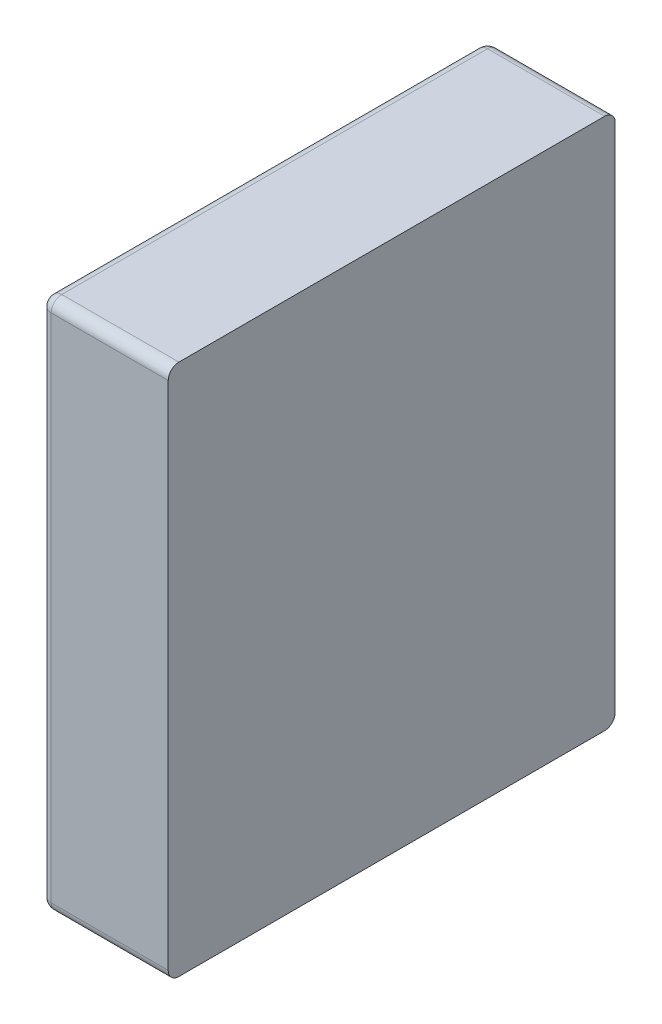
ISO-10303-21;
HEADER;
FILE_DESCRIPTION(('STEP AP214'),'2;1');
FILE_NAME('part.step','',(''),(''),'','','');
FILE_SCHEMA(('AUTOMOTIVE_DESIGN { 1 0 10303 214 1 1 1 1 }'));
ENDSEC;
DATA;
#1=APPLICATION_CONTEXT('core data for automotive mechanical design processes');
#2=APPLICATION_PROTOCOL_DEFINITION('international standard','automotive_design',2000,#1);
#3=PRODUCT_CONTEXT('',#1,'mechanical');
#4=PRODUCT('Part','Part','',(#3));
#5=PRODUCT_RELATED_PRODUCT_CATEGORY('part','',(#4));
#6=PRODUCT_DEFINITION_FORMATION('','',#4);
#7=PRODUCT_DEFINITION_CONTEXT('part definition',#1,'design');
#8=PRODUCT_DEFINITION('design','',#6,#7);
#9=PRODUCT_DEFINITION_SHAPE('','',#8);
#10=(LENGTH_UNIT() NAMED_UNIT(*) SI_UNIT(.MILLI.,.METRE.));
#11=(NAMED_UNIT(*) PLANE_ANGLE_UNIT() SI_UNIT($,.RADIAN.));
#12=(NAMED_UNIT(*) SI_UNIT($,.STERADIAN.) SOLID_ANGLE_UNIT());
#13=UNCERTAINTY_MEASURE_WITH_UNIT(LENGTH_MEASURE(1.E-05),#10,'distance_accuracy_value','');
#14=(GEOMETRIC_REPRESENTATION_CONTEXT(3) GLOBAL_UNCERTAINTY_ASSIGNED_CONTEXT((#13)) GLOBAL_UNIT_ASSIGNED_CONTEXT((#10,
#11,#12)) REPRESENTATION_CONTEXT('',''));
#15=CARTESIAN_POINT('',(0.,0.,0.));
#16=DIRECTION('',(0.,0.,1.));
#17=DIRECTION('',(1.,0.,0.));
#18=AXIS2_PLACEMENT_3D('',#15,#16,#17);
#19=CARTESIAN_POINT('',(-1.15,1.2,0.0499999999999999));
#20=DIRECTION('',(-1.,0.,0.));
#21=DIRECTION('',(0.,0.707106781186548,-0.707106781186547));
#22=AXIS2_PLACEMENT_3D('',#19,#20,#21);
#23=CYLINDRICAL_SURFACE('',#22,0.0499999999999999);
#24=CARTESIAN_POINT('',(-1.,1.2,0.0499999999999999));
#25=DIRECTION('',(-1.,0.,0.));
#26=DIRECTION('',(0.,0.707106781186548,-0.707106781186547));
#27=AXIS2_PLACEMENT_3D('',#24,#25,#26);
#28=CIRCLE('',#27,0.0499999999999999);
#29=CARTESIAN_POINT('',(-1.,1.25,0.0499999999999999));
#30=VERTEX_POINT('',#29);
#31=CARTESIAN_POINT('',(-1.,1.2,0.));
#32=VERTEX_POINT('',#31);
#33=EDGE_CURVE('E11',#30,#32,#28,.T.);
#34=ORIENTED_EDGE('',*,*,#33,.T.);
#35=DIRECTION('',(-1.,0.,0.));
#36=VECTOR('',#35,1.);
#37=CARTESIAN_POINT('',(-1.15,1.2,0.));
#38=LINE('',#37,#36);
#39=CARTESIAN_POINT('',(-1.55,1.2,0.));
#40=VERTEX_POINT('',#39);
#41=EDGE_CURVE('E24',#32,#40,#38,.T.);
#42=ORIENTED_EDGE('',*,*,#41,.T.);
#43=CARTESIAN_POINT('',(-1.55,1.2,0.0499999999999999));
#44=DIRECTION('',(1.,0.,0.));
#45=DIRECTION('',(0.,0.,-1.));
#46=AXIS2_PLACEMENT_3D('',#43,#44,#45);
#47=CIRCLE('',#46,0.0499999999999999);
#48=CARTESIAN_POINT('',(-1.55,1.25,0.0499999999999999));
#49=VERTEX_POINT('',#48);
#50=EDGE_CURVE('E249',#40,#49,#47,.T.);
#51=ORIENTED_EDGE('',*,*,#50,.T.);
#52=DIRECTION('',(1.,0.,0.));
#53=VECTOR('',#52,1.);
#54=CARTESIAN_POINT('',(-1.15,1.25,0.0499999999999999));
#55=LINE('',#54,#53);
#56=EDGE_CURVE('E247',#49,#30,#55,.T.);
#57=ORIENTED_EDGE('',*,*,#56,.T.);
#58=EDGE_LOOP('',(#34,#42,#51,#57));
#59=FACE_BOUND('',#58,.T.);
#60=ADVANCED_FACE('F17',(#59),#23,.T.);
#61=CARTESIAN_POINT('',(-1.55,0.6,0.0499999999999999));
#62=DIRECTION('',(0.,-1.,0.));
#63=DIRECTION('',(-0.707106781186548,0.,-0.707106781186547));
#64=AXIS2_PLACEMENT_3D('',#61,#62,#63);
#65=CYLINDRICAL_SURFACE('',#64,0.0499999999999999);
#66=CARTESIAN_POINT('',(-1.55,1.2,0.0499999999999999));
#67=DIRECTION('',(0.,-1.,0.));
#68=DIRECTION('',(-1.,0.,0.));
#69=AXIS2_PLACEMENT_3D('',#66,#67,#68);
#70=CIRCLE('',#69,0.0499999999999999);
#71=CARTESIAN_POINT('',(-1.6,1.2,0.0499999999999999));
#72=VERTEX_POINT('',#71);
#73=EDGE_CURVE('E235',#72,#40,#70,.T.);
#74=ORIENTED_EDGE('',*,*,#73,.T.);
#75=DIRECTION('',(0.,-1.,0.));
#76=VECTOR('',#75,1.);
#77=CARTESIAN_POINT('',(-1.55,0.6,0.));
#78=LINE('',#77,#76);
#79=CARTESIAN_POINT('',(-1.55,-1.2,0.));
#80=VERTEX_POINT('',#79);
#81=EDGE_CURVE('E225',#40,#80,#78,.T.);
#82=ORIENTED_EDGE('',*,*,#81,.T.);
#83=CARTESIAN_POINT('',(-1.55,-1.2,0.0499999999999999));
#84=DIRECTION('',(0.,1.,0.));
#85=DIRECTION('',(0.,0.,-1.));
#86=AXIS2_PLACEMENT_3D('',#83,#84,#85);
#87=CIRCLE('',#86,0.0499999999999999);
#88=CARTESIAN_POINT('',(-1.6,-1.2,0.0499999999999999));
#89=VERTEX_POINT('',#88);
#90=EDGE_CURVE('E190',#80,#89,#87,.T.);
#91=ORIENTED_EDGE('',*,*,#90,.T.);
#92=DIRECTION('',(0.,1.,0.));
#93=VECTOR('',#92,1.);
#94=CARTESIAN_POINT('',(-1.6,0.6,0.0499999999999999));
#95=LINE('',#94,#93);
#96=EDGE_CURVE('E185',#89,#72,#95,.T.);
#97=ORIENTED_EDGE('',*,*,#96,.T.);
#98=EDGE_LOOP('',(#74,#82,#91,#97));
#99=FACE_BOUND('',#98,.T.);
#100=ADVANCED_FACE('F217',(#99),#65,.T.);
#101=CARTESIAN_POINT('',(-1.55,1.2,0.0499999999999999));
#102=DIRECTION('',(0.408248290463866,-0.408248290463862,-0.816496580927725));
#103=DIRECTION('',(-0.577350269189627,0.577350269189623,-0.577350269189627));
#104=AXIS2_PLACEMENT_3D('',#101,#102,#103);
#105=SPHERICAL_SURFACE('',#104,0.0499999999999999);
#106=ORIENTED_EDGE('',*,*,#73,.F.);
#107=CARTESIAN_POINT('',(-1.55,1.2,0.0499999999999999));
#108=DIRECTION('',(0.,0.,-1.));
#109=DIRECTION('',(0.,1.,0.));
#110=AXIS2_PLACEMENT_3D('',#107,#108,#109);
#111=CIRCLE('',#110,0.0500000000000004);
#112=EDGE_CURVE('E180',#72,#49,#111,.T.);
#113=ORIENTED_EDGE('',*,*,#112,.T.);
#114=ORIENTED_EDGE('',*,*,#50,.F.);
#115=EDGE_LOOP('',(#106,#113,#114));
#116=FACE_BOUND('',#115,.T.);
#117=ADVANCED_FACE('F213',(#116),#105,.T.);
#118=CARTESIAN_POINT('',(-1.425,-1.2,0.0499999999999999));
#119=DIRECTION('',(1.,0.,0.));
#120=DIRECTION('',(0.,-0.707106781186548,-0.707106781186547));
#121=AXIS2_PLACEMENT_3D('',#118,#119,#120);
#122=CYLINDRICAL_SURFACE('',#121,0.0499999999999999);
#123=CARTESIAN_POINT('',(-1.,-1.2,0.0499999999999999));
#124=DIRECTION('',(-1.,0.,0.));
#125=DIRECTION('',(0.,-0.707106781186548,-0.707106781186547));
#126=AXIS2_PLACEMENT_3D('',#123,#124,#125);
#127=CIRCLE('',#126,0.0499999999999999);
#128=CARTESIAN_POINT('',(-1.,-1.2,0.));
#129=VERTEX_POINT('',#128);
#130=CARTESIAN_POINT('',(-1.,-1.25,0.0499999999999999));
#131=VERTEX_POINT('',#130);
#132=EDGE_CURVE('E178',#129,#131,#127,.T.);
#133=ORIENTED_EDGE('',*,*,#132,.T.);
#134=DIRECTION('',(-1.,0.,0.));
#135=VECTOR('',#134,1.);
#136=CARTESIAN_POINT('',(-1.425,-1.25,0.0499999999999999));
#137=LINE('',#136,#135);
#138=CARTESIAN_POINT('',(-1.55,-1.25,0.0499999999999999));
#139=VERTEX_POINT('',#138);
#140=EDGE_CURVE('E176',#131,#139,#137,.T.);
#141=ORIENTED_EDGE('',*,*,#140,.T.);
#142=CARTESIAN_POINT('',(-1.55,-1.2,0.0499999999999999));
#143=DIRECTION('',(1.,0.,0.));
#144=DIRECTION('',(0.,-1.,0.));
#145=AXIS2_PLACEMENT_3D('',#142,#143,#144);
#146=CIRCLE('',#145,0.0500000000000001);
#147=EDGE_CURVE('E171',#139,#80,#146,.T.);
#148=ORIENTED_EDGE('',*,*,#147,.T.);
#149=DIRECTION('',(1.,0.,0.));
#150=VECTOR('',#149,1.);
#151=CARTESIAN_POINT('',(-1.425,-1.2,0.));
#152=LINE('',#151,#150);
#153=EDGE_CURVE('E166',#80,#129,#152,.T.);
#154=ORIENTED_EDGE('',*,*,#153,.T.);
#155=EDGE_LOOP('',(#133,#141,#148,#154));
#156=FACE_BOUND('',#155,.T.);
#157=ADVANCED_FACE('F208',(#156),#122,.T.);
#158=CARTESIAN_POINT('',(-1.55,-1.2,0.0499999999999999));
#159=DIRECTION('',(-0.816496580927728,0.408248290463862,0.408248290463861));
#160=DIRECTION('',(-0.577350269189624,-0.577350269189629,-0.577350269189625));
#161=AXIS2_PLACEMENT_3D('',#158,#159,#160);
#162=SPHERICAL_SURFACE('',#161,0.0499999999999999);
#163=ORIENTED_EDGE('',*,*,#147,.F.);
#164=CARTESIAN_POINT('',(-1.55,-1.2,0.0499999999999999));
#165=DIRECTION('',(0.,0.,-1.));
#166=DIRECTION('',(-1.,0.,0.));
#167=AXIS2_PLACEMENT_3D('',#164,#165,#166);
#168=CIRCLE('',#167,0.0500000000000001);
#169=EDGE_CURVE('E161',#139,#89,#168,.T.);
#170=ORIENTED_EDGE('',*,*,#169,.T.);
#171=ORIENTED_EDGE('',*,*,#90,.F.);
#172=EDGE_LOOP('',(#163,#170,#171));
#173=FACE_BOUND('',#172,.T.);
#174=ADVANCED_FACE('F197',(#173),#162,.T.);
#175=CARTESIAN_POINT('',(-1.55,1.2,0.));
#176=DIRECTION('',(0.,0.,1.));
#177=DIRECTION('',(0.,1.,0.));
#178=AXIS2_PLACEMENT_3D('',#175,#176,#177);
#179=CYLINDRICAL_SURFACE('',#178,0.0500000000000004);
#180=ORIENTED_EDGE('',*,*,#112,.F.);
#181=DIRECTION('',(0.,0.,1.));
#182=VECTOR('',#181,1.);
#183=CARTESIAN_POINT('',(-1.6,1.2,0.));
#184=LINE('',#183,#182);
#185=CARTESIAN_POINT('',(-1.6,1.2,2.05));
#186=VERTEX_POINT('',#185);
#187=EDGE_CURVE('E157',#72,#186,#184,.T.);
#188=ORIENTED_EDGE('',*,*,#187,.T.);
#189=CARTESIAN_POINT('',(-1.55,1.2,2.05));
#190=DIRECTION('',(0.,0.,1.));
#191=DIRECTION('',(0.,1.,0.));
#192=AXIS2_PLACEMENT_3D('',#189,#190,#191);
#193=CIRCLE('',#192,0.0500000000000004);
#194=CARTESIAN_POINT('',(-1.55,1.25,2.05));
#195=VERTEX_POINT('',#194);
#196=EDGE_CURVE('E154',#195,#186,#193,.T.);
#197=ORIENTED_EDGE('',*,*,#196,.F.);
#198=DIRECTION('',(0.,0.,1.));
#199=VECTOR('',#198,1.);
#200=CARTESIAN_POINT('',(-1.55,1.25,0.));
#201=LINE('',#200,#199);
#202=EDGE_CURVE('E151',#49,#195,#201,.T.);
#203=ORIENTED_EDGE('',*,*,#202,.F.);
#204=EDGE_LOOP('',(#180,#188,#197,#203));
#205=FACE_BOUND('',#204,.T.);
#206=ADVANCED_FACE('F207',(#205),#179,.T.);
#207=CARTESIAN_POINT('',(-1.6,1.2,0.));
#208=DIRECTION('',(-1.,0.,0.));
#209=DIRECTION('',(0.,-1.,0.));
#210=AXIS2_PLACEMENT_3D('',#207,#208,#209);
#211=PLANE('',#210);
#212=ORIENTED_EDGE('',*,*,#96,.F.);
#213=DIRECTION('',(0.,0.,1.));
#214=VECTOR('',#213,1.);
#215=CARTESIAN_POINT('',(-1.6,-1.2,0.));
#216=LINE('',#215,#214);
#217=CARTESIAN_POINT('',(-1.6,-1.2,2.05));
#218=VERTEX_POINT('',#217);
#219=EDGE_CURVE('E147',#89,#218,#216,.T.);
#220=ORIENTED_EDGE('',*,*,#219,.T.);
#221=DIRECTION('',(0.,-1.,0.));
#222=VECTOR('',#221,1.);
#223=CARTESIAN_POINT('',(-1.6,0.6,2.05));
#224=LINE('',#223,#222);
#225=EDGE_CURVE('E144',#186,#218,#224,.T.);
#226=ORIENTED_EDGE('',*,*,#225,.F.);
#227=ORIENTED_EDGE('',*,*,#187,.F.);
#228=EDGE_LOOP('',(#212,#220,#226,#227));
#229=FACE_BOUND('',#228,.T.);
#230=ADVANCED_FACE('F325',(#229),#211,.T.);
#231=CARTESIAN_POINT('',(-1.55,-1.2,0.));
#232=DIRECTION('',(0.,0.,1.));
#233=DIRECTION('',(-1.,0.,0.));
#234=AXIS2_PLACEMENT_3D('',#231,#232,#233);
#235=CYLINDRICAL_SURFACE('',#234,0.0500000000000001);
#236=ORIENTED_EDGE('',*,*,#169,.F.);
#237=DIRECTION('',(0.,0.,1.));
#238=VECTOR('',#237,1.);
#239=CARTESIAN_POINT('',(-1.55,-1.25,0.));
#240=LINE('',#239,#238);
#241=CARTESIAN_POINT('',(-1.55,-1.25,2.05));
#242=VERTEX_POINT('',#241);
#243=EDGE_CURVE('E142',#139,#242,#240,.T.);
#244=ORIENTED_EDGE('',*,*,#243,.T.);
#245=CARTESIAN_POINT('',(-1.55,-1.2,2.05));
#246=DIRECTION('',(0.,0.,1.));
#247=DIRECTION('',(-1.,0.,0.));
#248=AXIS2_PLACEMENT_3D('',#245,#246,#247);
#249=CIRCLE('',#248,0.0500000000000001);
#250=EDGE_CURVE('E139',#218,#242,#249,.T.);
#251=ORIENTED_EDGE('',*,*,#250,.F.);
#252=ORIENTED_EDGE('',*,*,#219,.F.);
#253=EDGE_LOOP('',(#236,#244,#251,#252));
#254=FACE_BOUND('',#253,.T.);
#255=ADVANCED_FACE('F332',(#254),#235,.T.);
#256=CARTESIAN_POINT('',(-1.55,-1.25,0.));
#257=DIRECTION('',(0.,-1.,0.));
#258=DIRECTION('',(1.,0.,0.));
#259=AXIS2_PLACEMENT_3D('',#256,#257,#258);
#260=PLANE('',#259);
#261=ORIENTED_EDGE('',*,*,#140,.F.);
#262=DIRECTION('',(0.,0.,1.));
#263=VECTOR('',#262,1.);
#264=CARTESIAN_POINT('',(-1.,-1.25,0.));
#265=LINE('',#264,#263);
#266=CARTESIAN_POINT('',(-1.,-1.25,2.05));
#267=VERTEX_POINT('',#266);
#268=EDGE_CURVE('E137',#131,#267,#265,.T.);
#269=ORIENTED_EDGE('',*,*,#268,.T.);
#270=DIRECTION('',(1.,0.,0.));
#271=VECTOR('',#270,1.);
#272=CARTESIAN_POINT('',(-1.425,-1.25,2.05));
#273=LINE('',#272,#271);
#274=EDGE_CURVE('E98',#242,#267,#273,.T.);
#275=ORIENTED_EDGE('',*,*,#274,.F.);
#276=ORIENTED_EDGE('',*,*,#243,.F.);
#277=EDGE_LOOP('',(#261,#269,#275,#276));
#278=FACE_BOUND('',#277,.T.);
#279=ADVANCED_FACE('F283',(#278),#260,.T.);
#280=CARTESIAN_POINT('',(-1.15,1.2,2.05));
#281=DIRECTION('',(-1.,0.,0.));
#282=DIRECTION('',(0.,0.707106781186548,0.707106781186548));
#283=AXIS2_PLACEMENT_3D('',#280,#281,#282);
#284=CYLINDRICAL_SURFACE('',#283,0.0499999999999999);
#285=CARTESIAN_POINT('',(-1.,1.2,2.05));
#286=DIRECTION('',(-1.,0.,0.));
#287=DIRECTION('',(0.,0.707106781186548,0.707106781186548));
#288=AXIS2_PLACEMENT_3D('',#285,#286,#287);
#289=CIRCLE('',#288,0.0499999999999999);
#290=CARTESIAN_POINT('',(-1.,1.2,2.1));
#291=VERTEX_POINT('',#290);
#292=CARTESIAN_POINT('',(-1.,1.25,2.05));
#293=VERTEX_POINT('',#292);
#294=EDGE_CURVE('E113',#291,#293,#289,.T.);
#295=ORIENTED_EDGE('',*,*,#294,.T.);
#296=DIRECTION('',(-1.,0.,0.));
#297=VECTOR('',#296,1.);
#298=CARTESIAN_POINT('',(-1.15,1.25,2.05));
#299=LINE('',#298,#297);
#300=EDGE_CURVE('E132',#293,#195,#299,.T.);
#301=ORIENTED_EDGE('',*,*,#300,.T.);
#302=CARTESIAN_POINT('',(-1.55,1.2,2.05));
#303=DIRECTION('',(1.,0.,0.));
#304=DIRECTION('',(0.,1.,0.));
#305=AXIS2_PLACEMENT_3D('',#302,#303,#304);
#306=CIRCLE('',#305,0.0500000000000001);
#307=CARTESIAN_POINT('',(-1.55,1.2,2.1));
#308=VERTEX_POINT('',#307);
#309=EDGE_CURVE('E130',#195,#308,#306,.T.);
#310=ORIENTED_EDGE('',*,*,#309,.T.);
#311=DIRECTION('',(1.,0.,0.));
#312=VECTOR('',#311,1.);
#313=CARTESIAN_POINT('',(-1.15,1.2,2.1));
#314=LINE('',#313,#312);
#315=EDGE_CURVE('E128',#308,#291,#314,.T.);
#316=ORIENTED_EDGE('',*,*,#315,.T.);
#317=EDGE_LOOP('',(#295,#301,#310,#316));
#318=FACE_BOUND('',#317,.T.);
#319=ADVANCED_FACE('F267',(#318),#284,.T.);
#320=CARTESIAN_POINT('',(-1.55,0.6,2.05));
#321=DIRECTION('',(0.,-1.,0.));
#322=DIRECTION('',(-0.707106781186548,0.,0.707106781186548));
#323=AXIS2_PLACEMENT_3D('',#320,#321,#322);
#324=CYLINDRICAL_SURFACE('',#323,0.0499999999999999);
#325=CARTESIAN_POINT('',(-1.55,1.2,2.05));
#326=DIRECTION('',(0.,-1.,0.));
#327=DIRECTION('',(0.,0.,1.));
#328=AXIS2_PLACEMENT_3D('',#325,#326,#327);
#329=CIRCLE('',#328,0.0500000000000001);
#330=EDGE_CURVE('E125',#308,#186,#329,.T.);
#331=ORIENTED_EDGE('',*,*,#330,.T.);
#332=ORIENTED_EDGE('',*,*,#225,.T.);
#333=CARTESIAN_POINT('',(-1.55,-1.2,2.05));
#334=DIRECTION('',(0.,1.,0.));
#335=DIRECTION('',(-1.,0.,0.));
#336=AXIS2_PLACEMENT_3D('',#333,#334,#335);
#337=CIRCLE('',#336,0.0500000000000001);
#338=CARTESIAN_POINT('',(-1.55,-1.2,2.1));
#339=VERTEX_POINT('',#338);
#340=EDGE_CURVE('E123',#218,#339,#337,.T.);
#341=ORIENTED_EDGE('',*,*,#340,.T.);
#342=DIRECTION('',(0.,1.,0.));
#343=VECTOR('',#342,1.);
#344=CARTESIAN_POINT('',(-1.55,0.6,2.1));
#345=LINE('',#344,#343);
#346=EDGE_CURVE('E101',#339,#308,#345,.T.);
#347=ORIENTED_EDGE('',*,*,#346,.T.);
#348=EDGE_LOOP('',(#331,#332,#341,#347));
#349=FACE_BOUND('',#348,.T.);
#350=ADVANCED_FACE('F273',(#349),#324,.T.);
#351=CARTESIAN_POINT('',(-1.55,1.2,2.05));
#352=DIRECTION('',(-0.408248290463862,-0.816496580927728,0.408248290463859));
#353=DIRECTION('',(-0.577350269189628,0.577350269189623,0.577350269189627));
#354=AXIS2_PLACEMENT_3D('',#351,#352,#353);
#355=SPHERICAL_SURFACE('',#354,0.0499999999999999);
#356=ORIENTED_EDGE('',*,*,#330,.F.);
#357=ORIENTED_EDGE('',*,*,#309,.F.);
#358=ORIENTED_EDGE('',*,*,#196,.T.);
#359=EDGE_LOOP('',(#356,#357,#358));
#360=FACE_BOUND('',#359,.T.);
#361=ADVANCED_FACE('F270',(#360),#355,.T.);
#362=CARTESIAN_POINT('',(-1.425,-1.2,2.05));
#363=DIRECTION('',(1.,0.,0.));
#364=DIRECTION('',(0.,-0.707106781186548,0.707106781186548));
#365=AXIS2_PLACEMENT_3D('',#362,#363,#364);
#366=CYLINDRICAL_SURFACE('',#365,0.0499999999999999);
#367=CARTESIAN_POINT('',(-1.,-1.2,2.05));
#368=DIRECTION('',(-1.,0.,0.));
#369=DIRECTION('',(0.,-0.707106781186548,0.707106781186548));
#370=AXIS2_PLACEMENT_3D('',#367,#368,#369);
#371=CIRCLE('',#370,0.0499999999999999);
#372=CARTESIAN_POINT('',(-1.,-1.2,2.1));
#373=VERTEX_POINT('',#372);
#374=EDGE_CURVE('E91',#267,#373,#371,.T.);
#375=ORIENTED_EDGE('',*,*,#374,.T.);
#376=DIRECTION('',(-1.,0.,0.));
#377=VECTOR('',#376,1.);
#378=CARTESIAN_POINT('',(-1.425,-1.2,2.1));
#379=LINE('',#378,#377);
#380=EDGE_CURVE('E95',#373,#339,#379,.T.);
#381=ORIENTED_EDGE('',*,*,#380,.T.);
#382=CARTESIAN_POINT('',(-1.55,-1.2,2.05));
#383=DIRECTION('',(1.,0.,0.));
#384=DIRECTION('',(0.,0.,1.));
#385=AXIS2_PLACEMENT_3D('',#382,#383,#384);
#386=CIRCLE('',#385,0.0500000000000001);
#387=EDGE_CURVE('E110',#339,#242,#386,.T.);
#388=ORIENTED_EDGE('',*,*,#387,.T.);
#389=ORIENTED_EDGE('',*,*,#274,.T.);
#390=EDGE_LOOP('',(#375,#381,#388,#389));
#391=FACE_BOUND('',#390,.T.);
#392=ADVANCED_FACE('F93',(#391),#366,.T.);
#393=CARTESIAN_POINT('',(-1.55,-1.2,2.05));
#394=DIRECTION('',(-0.816496580927728,0.408248290463862,-0.408248290463859));
#395=DIRECTION('',(-0.577350269189623,-0.577350269189629,0.577350269189626));
#396=AXIS2_PLACEMENT_3D('',#393,#394,#395);
#397=SPHERICAL_SURFACE('',#396,0.0499999999999999);
#398=ORIENTED_EDGE('',*,*,#387,.F.);
#399=ORIENTED_EDGE('',*,*,#340,.F.);
#400=ORIENTED_EDGE('',*,*,#250,.T.);
#401=EDGE_LOOP('',(#398,#399,#400));
#402=FACE_BOUND('',#401,.T.);
#403=ADVANCED_FACE('F277',(#402),#397,.T.);
#404=CARTESIAN_POINT('',(-1.3,0.,2.1));
#405=DIRECTION('',(0.,0.,1.));
#406=DIRECTION('',(1.,0.,0.));
#407=AXIS2_PLACEMENT_3D('',#404,#405,#406);
#408=PLANE('',#407);
#409=ORIENTED_EDGE('',*,*,#315,.F.);
#410=ORIENTED_EDGE('',*,*,#346,.F.);
#411=ORIENTED_EDGE('',*,*,#380,.F.);
#412=DIRECTION('',(0.,1.,0.));
#413=VECTOR('',#412,1.);
#414=CARTESIAN_POINT('',(-1.,-1.25,2.1));
#415=LINE('',#414,#413);
#416=EDGE_CURVE('E108',#373,#291,#415,.T.);
#417=ORIENTED_EDGE('',*,*,#416,.T.);
#418=EDGE_LOOP('',(#409,#410,#411,#417));
#419=FACE_BOUND('',#418,.T.);
#420=ADVANCED_FACE('F107',(#419),#408,.T.);
#421=CARTESIAN_POINT('',(-1.,-1.25,0.));
#422=DIRECTION('',(1.,0.,0.));
#423=DIRECTION('',(0.,1.,0.));
#424=AXIS2_PLACEMENT_3D('',#421,#422,#423);
#425=PLANE('',#424);
#426=ORIENTED_EDGE('',*,*,#33,.F.);
#427=DIRECTION('',(0.,0.,1.));
#428=VECTOR('',#427,1.);
#429=CARTESIAN_POINT('',(-1.,1.25,0.));
#430=LINE('',#429,#428);
#431=EDGE_CURVE('E115',#30,#293,#430,.T.);
#432=ORIENTED_EDGE('',*,*,#431,.T.);
#433=ORIENTED_EDGE('',*,*,#294,.F.);
#434=ORIENTED_EDGE('',*,*,#416,.F.);
#435=ORIENTED_EDGE('',*,*,#374,.F.);
#436=ORIENTED_EDGE('',*,*,#268,.F.);
#437=ORIENTED_EDGE('',*,*,#132,.F.);
#438=DIRECTION('',(0.,1.,0.));
#439=VECTOR('',#438,1.);
#440=CARTESIAN_POINT('',(-1.,-1.25,0.));
#441=LINE('',#440,#439);
#442=EDGE_CURVE('E118',#129,#32,#441,.T.);
#443=ORIENTED_EDGE('',*,*,#442,.T.);
#444=EDGE_LOOP('',(#426,#432,#433,#434,#435,#436,#437,#443));
#445=FACE_BOUND('',#444,.T.);
#446=ADVANCED_FACE('F112',(#445),#425,.T.);
#447=CARTESIAN_POINT('',(-1.,1.25,0.));
#448=DIRECTION('',(0.,1.,0.));
#449=DIRECTION('',(-1.,0.,0.));
#450=AXIS2_PLACEMENT_3D('',#447,#448,#449);
#451=PLANE('',#450);
#452=ORIENTED_EDGE('',*,*,#56,.F.);
#453=ORIENTED_EDGE('',*,*,#202,.T.);
#454=ORIENTED_EDGE('',*,*,#300,.F.);
#455=ORIENTED_EDGE('',*,*,#431,.F.);
#456=EDGE_LOOP('',(#452,#453,#454,#455));
#457=FACE_BOUND('',#456,.T.);
#458=ADVANCED_FACE('F263',(#457),#451,.T.);
#459=CARTESIAN_POINT('',(-1.3,0.,0.));
#460=DIRECTION('',(0.,0.,1.));
#461=DIRECTION('',(1.,0.,0.));
#462=AXIS2_PLACEMENT_3D('',#459,#460,#461);
#463=PLANE('',#462);
#464=ORIENTED_EDGE('',*,*,#41,.F.);
#465=ORIENTED_EDGE('',*,*,#442,.F.);
#466=ORIENTED_EDGE('',*,*,#153,.F.);
#467=ORIENTED_EDGE('',*,*,#81,.F.);
#468=EDGE_LOOP('',(#464,#465,#466,#467));
#469=FACE_BOUND('',#468,.T.);
#470=ADVANCED_FACE('F286',(#469),#463,.F.);
#471=CLOSED_SHELL('',(#60,#100,#117,#157,#174,#206,#230,#255,#279,#319,#350,#361,#392,#403,#420,
#446,#458,#470));
#472=MANIFOLD_SOLID_BREP('B1',#471);
#473=ADVANCED_BREP_SHAPE_REPRESENTATION('',(#18,#472),#14);
#474=SHAPE_DEFINITION_REPRESENTATION(#9,#473);
ENDSEC;
END-ISO-10303-21;
